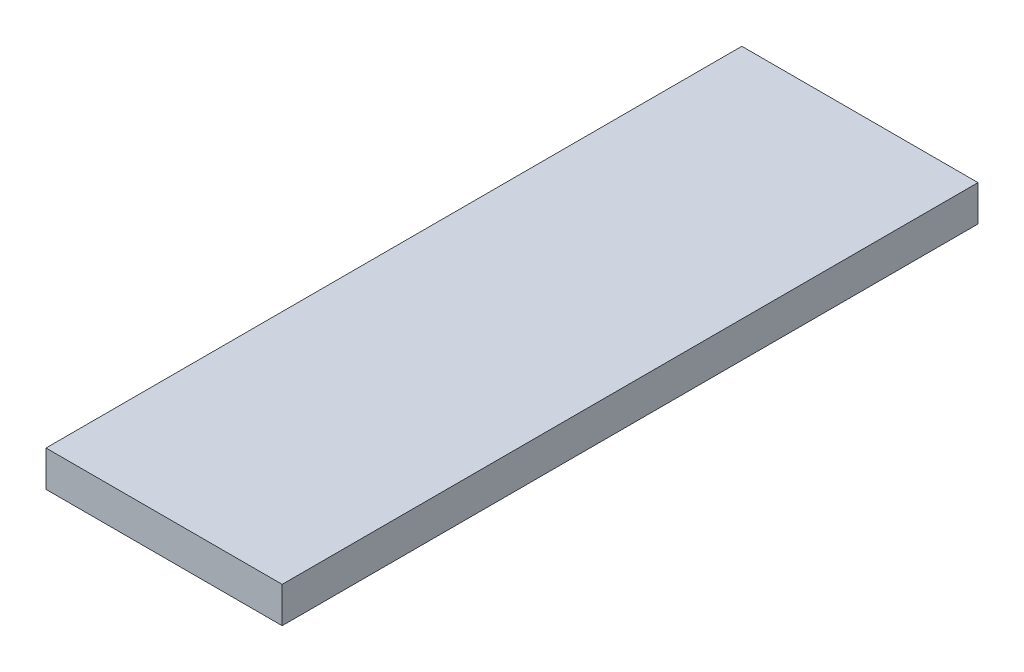
ISO-10303-21;
HEADER;
FILE_DESCRIPTION(('STEP AP214'),'2;1');
FILE_NAME('part.step','',(''),(''),'','','');
FILE_SCHEMA(('AUTOMOTIVE_DESIGN { 1 0 10303 214 1 1 1 1 }'));
ENDSEC;
DATA;
#1=APPLICATION_CONTEXT('core data for automotive mechanical design processes');
#2=APPLICATION_PROTOCOL_DEFINITION('international standard','automotive_design',2000,#1);
#3=PRODUCT_CONTEXT('',#1,'mechanical');
#4=PRODUCT('Part','Part','',(#3));
#5=PRODUCT_RELATED_PRODUCT_CATEGORY('part','',(#4));
#6=PRODUCT_DEFINITION_FORMATION('','',#4);
#7=PRODUCT_DEFINITION_CONTEXT('part definition',#1,'design');
#8=PRODUCT_DEFINITION('design','',#6,#7);
#9=PRODUCT_DEFINITION_SHAPE('','',#8);
#10=(LENGTH_UNIT() NAMED_UNIT(*) SI_UNIT(.MILLI.,.METRE.));
#11=(NAMED_UNIT(*) PLANE_ANGLE_UNIT() SI_UNIT($,.RADIAN.));
#12=(NAMED_UNIT(*) SI_UNIT($,.STERADIAN.) SOLID_ANGLE_UNIT());
#13=UNCERTAINTY_MEASURE_WITH_UNIT(LENGTH_MEASURE(1.E-05),#10,'distance_accuracy_value','');
#14=(GEOMETRIC_REPRESENTATION_CONTEXT(3) GLOBAL_UNCERTAINTY_ASSIGNED_CONTEXT((#13)) GLOBAL_UNIT_ASSIGNED_CONTEXT((#10,
#11,#12)) REPRESENTATION_CONTEXT('',''));
#15=CARTESIAN_POINT('',(0.,0.,0.));
#16=DIRECTION('',(0.,0.,1.));
#17=DIRECTION('',(1.,0.,0.));
#18=AXIS2_PLACEMENT_3D('',#15,#16,#17);
#19=CARTESIAN_POINT('',(28.,4.25,82.5));
#20=DIRECTION('',(-1.,0.,0.));
#21=DIRECTION('',(0.,0.,1.));
#22=AXIS2_PLACEMENT_3D('',#19,#20,#21);
#23=PLANE('',#22);
#24=DIRECTION('',(0.,0.,-1.));
#25=VECTOR('',#24,1.);
#26=CARTESIAN_POINT('',(28.,-4.25,82.5));
#27=LINE('',#26,#25);
#28=CARTESIAN_POINT('',(28.,-4.25,82.5));
#29=VERTEX_POINT('',#28);
#30=CARTESIAN_POINT('',(28.,-4.25,-82.5));
#31=VERTEX_POINT('',#30);
#32=EDGE_CURVE('E99',#29,#31,#27,.T.);
#33=ORIENTED_EDGE('',*,*,#32,.T.);
#34=DIRECTION('',(0.,-1.,0.));
#35=VECTOR('',#34,1.);
#36=CARTESIAN_POINT('',(28.,4.25,-82.5));
#37=LINE('',#36,#35);
#38=CARTESIAN_POINT('',(28.,4.25,-82.5));
#39=VERTEX_POINT('',#38);
#40=EDGE_CURVE('E11',#39,#31,#37,.T.);
#41=ORIENTED_EDGE('',*,*,#40,.F.);
#42=DIRECTION('',(0.,0.,-1.));
#43=VECTOR('',#42,1.);
#44=CARTESIAN_POINT('',(28.,4.25,82.5));
#45=LINE('',#44,#43);
#46=CARTESIAN_POINT('',(28.,4.25,82.5));
#47=VERTEX_POINT('',#46);
#48=EDGE_CURVE('E87',#47,#39,#45,.T.);
#49=ORIENTED_EDGE('',*,*,#48,.F.);
#50=DIRECTION('',(0.,-1.,0.));
#51=VECTOR('',#50,1.);
#52=CARTESIAN_POINT('',(28.,4.25,82.5));
#53=LINE('',#52,#51);
#54=EDGE_CURVE('E95',#47,#29,#53,.T.);
#55=ORIENTED_EDGE('',*,*,#54,.T.);
#56=EDGE_LOOP('',(#33,#41,#49,#55));
#57=FACE_BOUND('',#56,.T.);
#58=ADVANCED_FACE('F36',(#57),#23,.F.);
#59=CARTESIAN_POINT('',(-28.,4.25,-82.5));
#60=DIRECTION('',(0.,0.,1.));
#61=DIRECTION('',(1.,0.,0.));
#62=AXIS2_PLACEMENT_3D('',#59,#60,#61);
#63=PLANE('',#62);
#64=DIRECTION('',(-1.,0.,0.));
#65=VECTOR('',#64,1.);
#66=CARTESIAN_POINT('',(-28.,-4.25,-82.5));
#67=LINE('',#66,#65);
#68=CARTESIAN_POINT('',(-28.,-4.25,-82.5));
#69=VERTEX_POINT('',#68);
#70=EDGE_CURVE('E91',#31,#69,#67,.T.);
#71=ORIENTED_EDGE('',*,*,#70,.T.);
#72=DIRECTION('',(0.,-1.,0.));
#73=VECTOR('',#72,1.);
#74=CARTESIAN_POINT('',(-28.,4.25,-82.5));
#75=LINE('',#74,#73);
#76=CARTESIAN_POINT('',(-28.,4.25,-82.5));
#77=VERTEX_POINT('',#76);
#78=EDGE_CURVE('E44',#77,#69,#75,.T.);
#79=ORIENTED_EDGE('',*,*,#78,.F.);
#80=DIRECTION('',(-1.,0.,0.));
#81=VECTOR('',#80,1.);
#82=CARTESIAN_POINT('',(-28.,4.25,-82.5));
#83=LINE('',#82,#81);
#84=EDGE_CURVE('E82',#39,#77,#83,.T.);
#85=ORIENTED_EDGE('',*,*,#84,.F.);
#86=ORIENTED_EDGE('',*,*,#40,.T.);
#87=EDGE_LOOP('',(#71,#79,#85,#86));
#88=FACE_BOUND('',#87,.T.);
#89=ADVANCED_FACE('F90',(#88),#63,.F.);
#90=CARTESIAN_POINT('',(-28.,4.25,82.5));
#91=DIRECTION('',(1.,0.,0.));
#92=DIRECTION('',(0.,0.,-1.));
#93=AXIS2_PLACEMENT_3D('',#90,#91,#92);
#94=PLANE('',#93);
#95=DIRECTION('',(0.,0.,1.));
#96=VECTOR('',#95,1.);
#97=CARTESIAN_POINT('',(-28.,-4.25,82.5));
#98=LINE('',#97,#96);
#99=CARTESIAN_POINT('',(-28.,-4.25,82.5));
#100=VERTEX_POINT('',#99);
#101=EDGE_CURVE('E69',#69,#100,#98,.T.);
#102=ORIENTED_EDGE('',*,*,#101,.T.);
#103=DIRECTION('',(0.,-1.,0.));
#104=VECTOR('',#103,1.);
#105=CARTESIAN_POINT('',(-28.,4.25,82.5));
#106=LINE('',#105,#104);
#107=CARTESIAN_POINT('',(-28.,4.25,82.5));
#108=VERTEX_POINT('',#107);
#109=EDGE_CURVE('E92',#108,#100,#106,.T.);
#110=ORIENTED_EDGE('',*,*,#109,.F.);
#111=DIRECTION('',(0.,0.,1.));
#112=VECTOR('',#111,1.);
#113=CARTESIAN_POINT('',(-28.,4.25,82.5));
#114=LINE('',#113,#112);
#115=EDGE_CURVE('E85',#77,#108,#114,.T.);
#116=ORIENTED_EDGE('',*,*,#115,.F.);
#117=ORIENTED_EDGE('',*,*,#78,.T.);
#118=EDGE_LOOP('',(#102,#110,#116,#117));
#119=FACE_BOUND('',#118,.T.);
#120=ADVANCED_FACE('F93',(#119),#94,.F.);
#121=CARTESIAN_POINT('',(-28.,4.25,82.5));
#122=DIRECTION('',(0.,0.,-1.));
#123=DIRECTION('',(-1.,0.,0.));
#124=AXIS2_PLACEMENT_3D('',#121,#122,#123);
#125=PLANE('',#124);
#126=DIRECTION('',(1.,0.,0.));
#127=VECTOR('',#126,1.);
#128=CARTESIAN_POINT('',(-28.,-4.25,82.5));
#129=LINE('',#128,#127);
#130=EDGE_CURVE('E75',#100,#29,#129,.T.);
#131=ORIENTED_EDGE('',*,*,#130,.T.);
#132=ORIENTED_EDGE('',*,*,#54,.F.);
#133=DIRECTION('',(1.,0.,0.));
#134=VECTOR('',#133,1.);
#135=CARTESIAN_POINT('',(-28.,4.25,82.5));
#136=LINE('',#135,#134);
#137=EDGE_CURVE('E52',#108,#47,#136,.T.);
#138=ORIENTED_EDGE('',*,*,#137,.F.);
#139=ORIENTED_EDGE('',*,*,#109,.T.);
#140=EDGE_LOOP('',(#131,#132,#138,#139));
#141=FACE_BOUND('',#140,.T.);
#142=ADVANCED_FACE('F106',(#141),#125,.F.);
#143=CARTESIAN_POINT('',(0.,4.25,0.));
#144=DIRECTION('',(0.,-1.,0.));
#145=DIRECTION('',(0.,0.,-1.));
#146=AXIS2_PLACEMENT_3D('',#143,#144,#145);
#147=PLANE('',#146);
#148=ORIENTED_EDGE('',*,*,#48,.T.);
#149=ORIENTED_EDGE('',*,*,#84,.T.);
#150=ORIENTED_EDGE('',*,*,#115,.T.);
#151=ORIENTED_EDGE('',*,*,#137,.T.);
#152=EDGE_LOOP('',(#148,#149,#150,#151));
#153=FACE_BOUND('',#152,.T.);
#154=ADVANCED_FACE('F83',(#153),#147,.F.);
#155=CARTESIAN_POINT('',(0.,-4.25,0.));
#156=DIRECTION('',(0.,-1.,0.));
#157=DIRECTION('',(0.,0.,-1.));
#158=AXIS2_PLACEMENT_3D('',#155,#156,#157);
#159=PLANE('',#158);
#160=ORIENTED_EDGE('',*,*,#32,.F.);
#161=ORIENTED_EDGE('',*,*,#130,.F.);
#162=ORIENTED_EDGE('',*,*,#101,.F.);
#163=ORIENTED_EDGE('',*,*,#70,.F.);
#164=EDGE_LOOP('',(#160,#161,#162,#163));
#165=FACE_BOUND('',#164,.T.);
#166=ADVANCED_FACE('F109',(#165),#159,.T.);
#167=CLOSED_SHELL('',(#58,#89,#120,#142,#154,#166));
#168=MANIFOLD_SOLID_BREP('B2',#167);
#169=ADVANCED_BREP_SHAPE_REPRESENTATION('',(#18,#168),#14);
#170=SHAPE_DEFINITION_REPRESENTATION(#9,#169);
ENDSEC;
END-ISO-10303-21;
